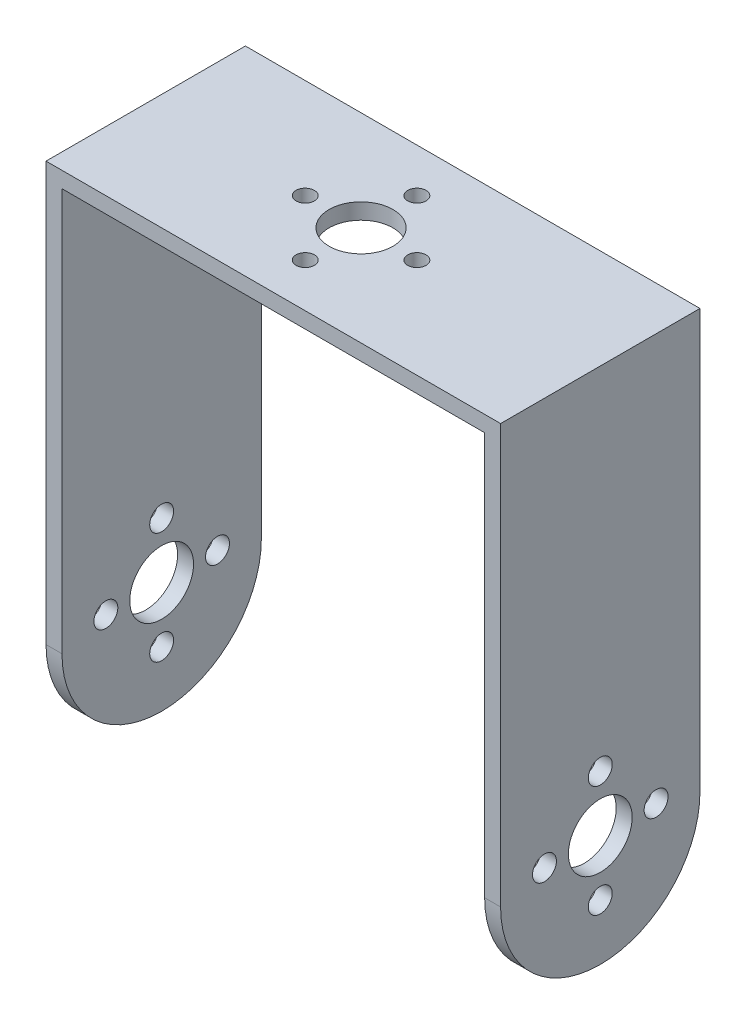
ISO-10303-21;
HEADER;
FILE_DESCRIPTION(('STEP AP214'),'2;1');
FILE_NAME('part.step','',(''),(''),'','','');
FILE_SCHEMA(('AUTOMOTIVE_DESIGN { 1 0 10303 214 1 1 1 1 }'));
ENDSEC;
DATA;
#1=APPLICATION_CONTEXT('core data for automotive mechanical design processes');
#2=APPLICATION_PROTOCOL_DEFINITION('international standard','automotive_design',2000,#1);
#3=PRODUCT_CONTEXT('',#1,'mechanical');
#4=PRODUCT('Part','Part','',(#3));
#5=PRODUCT_RELATED_PRODUCT_CATEGORY('part','',(#4));
#6=PRODUCT_DEFINITION_FORMATION('','',#4);
#7=PRODUCT_DEFINITION_CONTEXT('part definition',#1,'design');
#8=PRODUCT_DEFINITION('design','',#6,#7);
#9=PRODUCT_DEFINITION_SHAPE('','',#8);
#10=(LENGTH_UNIT() NAMED_UNIT(*) SI_UNIT(.MILLI.,.METRE.));
#11=(NAMED_UNIT(*) PLANE_ANGLE_UNIT() SI_UNIT($,.RADIAN.));
#12=(NAMED_UNIT(*) SI_UNIT($,.STERADIAN.) SOLID_ANGLE_UNIT());
#13=UNCERTAINTY_MEASURE_WITH_UNIT(LENGTH_MEASURE(1.E-05),#10,'distance_accuracy_value','');
#14=(GEOMETRIC_REPRESENTATION_CONTEXT(3) GLOBAL_UNCERTAINTY_ASSIGNED_CONTEXT((#13)) GLOBAL_UNIT_ASSIGNED_CONTEXT((#10,
#11,#12)) REPRESENTATION_CONTEXT('',''));
#15=CARTESIAN_POINT('',(0.,0.,0.));
#16=DIRECTION('',(0.,0.,1.));
#17=DIRECTION('',(1.,0.,0.));
#18=AXIS2_PLACEMENT_3D('',#15,#16,#17);
#19=CARTESIAN_POINT('',(-79.925523148209,43.3899538371544,25.));
#20=DIRECTION('',(-1.,0.,0.));
#21=DIRECTION('',(0.,0.,1.));
#22=AXIS2_PLACEMENT_3D('',#19,#20,#21);
#23=PLANE('',#22);
#24=CARTESIAN_POINT('',(-79.925523148209,-5.61349741649561,19.4999999999999));
#25=DIRECTION('',(-1.,0.,0.));
#26=DIRECTION('',(0.,0.,1.));
#27=AXIS2_PLACEMENT_3D('',#24,#25,#26);
#28=CIRCLE('',#27,1.5);
#29=CARTESIAN_POINT('',(-79.925523148209,-5.61349741649561,20.9999999999999));
#30=VERTEX_POINT('',#29);
#31=EDGE_CURVE('E218',#30,#30,#28,.T.);
#32=ORIENTED_EDGE('',*,*,#31,.T.);
#33=EDGE_LOOP('',(#32));
#34=FACE_BOUND('',#33,.T.);
#35=CARTESIAN_POINT('',(-79.925523148209,-12.6134974164956,12.4999999999999));
#36=DIRECTION('',(-1.,0.,0.));
#37=DIRECTION('',(0.,0.,1.));
#38=AXIS2_PLACEMENT_3D('',#35,#36,#37);
#39=CIRCLE('',#38,1.5);
#40=CARTESIAN_POINT('',(-79.925523148209,-12.6134974164956,13.9999999999999));
#41=VERTEX_POINT('',#40);
#42=EDGE_CURVE('E222',#41,#41,#39,.T.);
#43=ORIENTED_EDGE('',*,*,#42,.T.);
#44=EDGE_LOOP('',(#43));
#45=FACE_BOUND('',#44,.T.);
#46=CARTESIAN_POINT('',(-79.925523148209,-5.61349741649551,5.4999999999999));
#47=DIRECTION('',(-1.,0.,0.));
#48=DIRECTION('',(0.,0.,1.));
#49=AXIS2_PLACEMENT_3D('',#46,#47,#48);
#50=CIRCLE('',#49,1.5);
#51=CARTESIAN_POINT('',(-79.925523148209,-5.61349741649551,6.9999999999999));
#52=VERTEX_POINT('',#51);
#53=EDGE_CURVE('E226',#52,#52,#50,.T.);
#54=ORIENTED_EDGE('',*,*,#53,.T.);
#55=EDGE_LOOP('',(#54));
#56=FACE_BOUND('',#55,.T.);
#57=CARTESIAN_POINT('',(-79.925523148209,1.38650258350442,12.5));
#58=DIRECTION('',(-1.,0.,0.));
#59=DIRECTION('',(0.,0.,1.));
#60=AXIS2_PLACEMENT_3D('',#57,#58,#59);
#61=CIRCLE('',#60,1.5);
#62=CARTESIAN_POINT('',(-79.925523148209,1.38650258350442,14.));
#63=VERTEX_POINT('',#62);
#64=EDGE_CURVE('E230',#63,#63,#61,.T.);
#65=ORIENTED_EDGE('',*,*,#64,.T.);
#66=EDGE_LOOP('',(#65));
#67=FACE_BOUND('',#66,.T.);
#68=CARTESIAN_POINT('',(-79.925523148209,-5.61349741649557,12.5));
#69=DIRECTION('',(-1.,0.,0.));
#70=DIRECTION('',(0.,0.,1.));
#71=AXIS2_PLACEMENT_3D('',#68,#69,#70);
#72=CIRCLE('',#71,4.);
#73=CARTESIAN_POINT('',(-79.925523148209,-5.61349741649557,16.5));
#74=VERTEX_POINT('',#73);
#75=EDGE_CURVE('E168',#74,#74,#72,.T.);
#76=ORIENTED_EDGE('',*,*,#75,.T.);
#77=EDGE_LOOP('',(#76));
#78=FACE_BOUND('',#77,.T.);
#79=DIRECTION('',(0.,1.,0.));
#80=VECTOR('',#79,1.);
#81=CARTESIAN_POINT('',(-79.925523148209,43.3899538371544,25.));
#82=LINE('',#81,#80);
#83=CARTESIAN_POINT('',(-79.925523148209,-7.11349741649558,25.));
#84=VERTEX_POINT('',#83);
#85=CARTESIAN_POINT('',(-79.925523148209,43.3899538371544,25.));
#86=VERTEX_POINT('',#85);
#87=EDGE_CURVE('E137',#84,#86,#82,.T.);
#88=ORIENTED_EDGE('',*,*,#87,.F.);
#89=CARTESIAN_POINT('',(-79.925523148209,-7.11349741649558,12.5));
#90=DIRECTION('',(-1.,0.,0.));
#91=DIRECTION('',(0.,0.,1.));
#92=AXIS2_PLACEMENT_3D('',#89,#90,#91);
#93=CIRCLE('',#92,12.5);
#94=CARTESIAN_POINT('',(-79.925523148209,-7.11349741649558,0.));
#95=VERTEX_POINT('',#94);
#96=EDGE_CURVE('E109',#95,#84,#93,.T.);
#97=ORIENTED_EDGE('',*,*,#96,.F.);
#98=DIRECTION('',(0.,1.,0.));
#99=VECTOR('',#98,1.);
#100=CARTESIAN_POINT('',(-79.925523148209,43.3899538371544,0.));
#101=LINE('',#100,#99);
#102=CARTESIAN_POINT('',(-79.925523148209,43.3899538371544,0.));
#103=VERTEX_POINT('',#102);
#104=EDGE_CURVE('E125',#95,#103,#101,.T.);
#105=ORIENTED_EDGE('',*,*,#104,.T.);
#106=DIRECTION('',(0.,0.,-1.));
#107=VECTOR('',#106,1.);
#108=CARTESIAN_POINT('',(-79.925523148209,43.3899538371544,25.));
#109=LINE('',#108,#107);
#110=EDGE_CURVE('E144',#86,#103,#109,.T.);
#111=ORIENTED_EDGE('',*,*,#110,.F.);
#112=EDGE_LOOP('',(#88,#97,#105,#111));
#113=FACE_BOUND('',#112,.T.);
#114=ADVANCED_FACE('F34',(#34,#45,#56,#67,#78,#113),#23,.F.);
#115=CARTESIAN_POINT('',(-26.925523148209,43.3899538371544,25.));
#116=DIRECTION('',(1.,0.,0.));
#117=DIRECTION('',(0.,1.,0.));
#118=AXIS2_PLACEMENT_3D('',#115,#116,#117);
#119=PLANE('',#118);
#120=CARTESIAN_POINT('',(-26.925523148209,-5.61349741649559,19.4999999999999));
#121=DIRECTION('',(1.,0.,0.));
#122=DIRECTION('',(0.,1.,0.));
#123=AXIS2_PLACEMENT_3D('',#120,#121,#122);
#124=CIRCLE('',#123,1.5);
#125=CARTESIAN_POINT('',(-26.925523148209,-4.11349741649559,19.4999999999999));
#126=VERTEX_POINT('',#125);
#127=EDGE_CURVE('E425',#126,#126,#124,.T.);
#128=ORIENTED_EDGE('',*,*,#127,.T.);
#129=EDGE_LOOP('',(#128));
#130=FACE_BOUND('',#129,.T.);
#131=CARTESIAN_POINT('',(-26.925523148209,-12.6134974164956,12.4999999999999));
#132=DIRECTION('',(1.,0.,0.));
#133=DIRECTION('',(0.,1.,0.));
#134=AXIS2_PLACEMENT_3D('',#131,#132,#133);
#135=CIRCLE('',#134,1.5);
#136=CARTESIAN_POINT('',(-26.925523148209,-11.1134974164956,12.4999999999999));
#137=VERTEX_POINT('',#136);
#138=EDGE_CURVE('E417',#137,#137,#135,.T.);
#139=ORIENTED_EDGE('',*,*,#138,.T.);
#140=EDGE_LOOP('',(#139));
#141=FACE_BOUND('',#140,.T.);
#142=CARTESIAN_POINT('',(-26.925523148209,-5.61349741649549,5.4999999999999));
#143=DIRECTION('',(1.,0.,0.));
#144=DIRECTION('',(0.,1.,0.));
#145=AXIS2_PLACEMENT_3D('',#142,#143,#144);
#146=CIRCLE('',#145,1.5);
#147=CARTESIAN_POINT('',(-26.925523148209,-4.11349741649549,5.4999999999999));
#148=VERTEX_POINT('',#147);
#149=EDGE_CURVE('E283',#148,#148,#146,.T.);
#150=ORIENTED_EDGE('',*,*,#149,.T.);
#151=EDGE_LOOP('',(#150));
#152=FACE_BOUND('',#151,.T.);
#153=CARTESIAN_POINT('',(-26.925523148209,1.38650258350444,12.5));
#154=DIRECTION('',(1.,0.,0.));
#155=DIRECTION('',(0.,1.,0.));
#156=AXIS2_PLACEMENT_3D('',#153,#154,#155);
#157=CIRCLE('',#156,1.5);
#158=CARTESIAN_POINT('',(-26.925523148209,2.88650258350444,12.5));
#159=VERTEX_POINT('',#158);
#160=EDGE_CURVE('E281',#159,#159,#157,.T.);
#161=ORIENTED_EDGE('',*,*,#160,.T.);
#162=EDGE_LOOP('',(#161));
#163=FACE_BOUND('',#162,.T.);
#164=CARTESIAN_POINT('',(-26.925523148209,-5.61349741649556,12.5));
#165=DIRECTION('',(1.,0.,0.));
#166=DIRECTION('',(0.,1.,0.));
#167=AXIS2_PLACEMENT_3D('',#164,#165,#166);
#168=CIRCLE('',#167,4.);
#169=CARTESIAN_POINT('',(-26.925523148209,-1.61349741649556,12.5));
#170=VERTEX_POINT('',#169);
#171=EDGE_CURVE('E164',#170,#170,#168,.T.);
#172=ORIENTED_EDGE('',*,*,#171,.T.);
#173=EDGE_LOOP('',(#172));
#174=FACE_BOUND('',#173,.T.);
#175=CARTESIAN_POINT('',(-26.925523148209,-7.11349741649557,12.5));
#176=DIRECTION('',(1.,0.,0.));
#177=DIRECTION('',(0.,1.,0.));
#178=AXIS2_PLACEMENT_3D('',#175,#176,#177);
#179=CIRCLE('',#178,12.5);
#180=CARTESIAN_POINT('',(-26.925523148209,-7.11349741649557,25.));
#181=VERTEX_POINT('',#180);
#182=CARTESIAN_POINT('',(-26.925523148209,-7.11349741649558,0.));
#183=VERTEX_POINT('',#182);
#184=EDGE_CURVE('E48',#181,#183,#179,.T.);
#185=ORIENTED_EDGE('',*,*,#184,.F.);
#186=DIRECTION('',(0.,-1.,0.));
#187=VECTOR('',#186,1.);
#188=CARTESIAN_POINT('',(-26.925523148209,43.3899538371544,25.));
#189=LINE('',#188,#187);
#190=CARTESIAN_POINT('',(-26.925523148209,43.3899538371544,25.));
#191=VERTEX_POINT('',#190);
#192=EDGE_CURVE('E179',#191,#181,#189,.T.);
#193=ORIENTED_EDGE('',*,*,#192,.F.);
#194=DIRECTION('',(0.,0.,-1.));
#195=VECTOR('',#194,1.);
#196=CARTESIAN_POINT('',(-26.925523148209,43.3899538371544,25.));
#197=LINE('',#196,#195);
#198=CARTESIAN_POINT('',(-26.925523148209,43.3899538371544,0.));
#199=VERTEX_POINT('',#198);
#200=EDGE_CURVE('E141',#191,#199,#197,.T.);
#201=ORIENTED_EDGE('',*,*,#200,.T.);
#202=DIRECTION('',(0.,-1.,0.));
#203=VECTOR('',#202,1.);
#204=CARTESIAN_POINT('',(-26.925523148209,43.3899538371544,0.));
#205=LINE('',#204,#203);
#206=EDGE_CURVE('E130',#199,#183,#205,.T.);
#207=ORIENTED_EDGE('',*,*,#206,.T.);
#208=EDGE_LOOP('',(#185,#193,#201,#207));
#209=FACE_BOUND('',#208,.T.);
#210=ADVANCED_FACE('F190',(#130,#141,#152,#163,#174,#209),#119,.F.);
#211=CARTESIAN_POINT('',(-24.925523148209,45.3865025835044,25.));
#212=DIRECTION('',(-1.,0.,0.));
#213=DIRECTION('',(0.,-1.,0.));
#214=AXIS2_PLACEMENT_3D('',#211,#212,#213);
#215=PLANE('',#214);
#216=CARTESIAN_POINT('',(-24.925523148209,-5.61349741649559,19.4999999999999));
#217=DIRECTION('',(1.,0.,0.));
#218=DIRECTION('',(0.,1.,0.));
#219=AXIS2_PLACEMENT_3D('',#216,#217,#218);
#220=CIRCLE('',#219,1.5);
#221=CARTESIAN_POINT('',(-24.925523148209,-4.11349741649559,19.4999999999999));
#222=VERTEX_POINT('',#221);
#223=EDGE_CURVE('E260',#222,#222,#220,.T.);
#224=ORIENTED_EDGE('',*,*,#223,.F.);
#225=EDGE_LOOP('',(#224));
#226=FACE_BOUND('',#225,.T.);
#227=CARTESIAN_POINT('',(-24.925523148209,-12.6134974164956,12.4999999999999));
#228=DIRECTION('',(1.,0.,0.));
#229=DIRECTION('',(0.,1.,0.));
#230=AXIS2_PLACEMENT_3D('',#227,#228,#229);
#231=CIRCLE('',#230,1.5);
#232=CARTESIAN_POINT('',(-24.925523148209,-11.1134974164956,12.4999999999999));
#233=VERTEX_POINT('',#232);
#234=EDGE_CURVE('E264',#233,#233,#231,.T.);
#235=ORIENTED_EDGE('',*,*,#234,.F.);
#236=EDGE_LOOP('',(#235));
#237=FACE_BOUND('',#236,.T.);
#238=CARTESIAN_POINT('',(-24.925523148209,-5.61349741649549,5.4999999999999));
#239=DIRECTION('',(1.,0.,0.));
#240=DIRECTION('',(0.,1.,0.));
#241=AXIS2_PLACEMENT_3D('',#238,#239,#240);
#242=CIRCLE('',#241,1.5);
#243=CARTESIAN_POINT('',(-24.925523148209,-4.11349741649549,5.4999999999999));
#244=VERTEX_POINT('',#243);
#245=EDGE_CURVE('E268',#244,#244,#242,.T.);
#246=ORIENTED_EDGE('',*,*,#245,.F.);
#247=EDGE_LOOP('',(#246));
#248=FACE_BOUND('',#247,.T.);
#249=CARTESIAN_POINT('',(-24.925523148209,1.38650258350444,12.5));
#250=DIRECTION('',(1.,0.,0.));
#251=DIRECTION('',(0.,1.,0.));
#252=AXIS2_PLACEMENT_3D('',#249,#250,#251);
#253=CIRCLE('',#252,1.5);
#254=CARTESIAN_POINT('',(-24.925523148209,2.88650258350444,12.5));
#255=VERTEX_POINT('',#254);
#256=EDGE_CURVE('E272',#255,#255,#253,.T.);
#257=ORIENTED_EDGE('',*,*,#256,.F.);
#258=EDGE_LOOP('',(#257));
#259=FACE_BOUND('',#258,.T.);
#260=CARTESIAN_POINT('',(-24.9255231482089,-5.61349741649556,12.5));
#261=DIRECTION('',(-1.,0.,0.));
#262=DIRECTION('',(0.,-1.,0.));
#263=AXIS2_PLACEMENT_3D('',#260,#261,#262);
#264=CIRCLE('',#263,4.);
#265=CARTESIAN_POINT('',(-24.9255231482089,-9.61349741649556,12.5));
#266=VERTEX_POINT('',#265);
#267=EDGE_CURVE('E157',#266,#266,#264,.T.);
#268=ORIENTED_EDGE('',*,*,#267,.T.);
#269=EDGE_LOOP('',(#268));
#270=FACE_BOUND('',#269,.T.);
#271=DIRECTION('',(0.,1.,0.));
#272=VECTOR('',#271,1.);
#273=CARTESIAN_POINT('',(-24.925523148209,45.3865025835044,25.));
#274=LINE('',#273,#272);
#275=CARTESIAN_POINT('',(-24.9255231482089,-7.11349741649557,25.));
#276=VERTEX_POINT('',#275);
#277=CARTESIAN_POINT('',(-24.925523148209,45.3865025835044,25.));
#278=VERTEX_POINT('',#277);
#279=EDGE_CURVE('E121',#276,#278,#274,.T.);
#280=ORIENTED_EDGE('',*,*,#279,.F.);
#281=CARTESIAN_POINT('',(-24.9255231482089,-7.11349741649557,12.5));
#282=DIRECTION('',(-1.,0.,0.));
#283=DIRECTION('',(0.,-1.,0.));
#284=AXIS2_PLACEMENT_3D('',#281,#282,#283);
#285=CIRCLE('',#284,12.5);
#286=CARTESIAN_POINT('',(-24.9255231482089,-7.11349741649557,0.));
#287=VERTEX_POINT('',#286);
#288=EDGE_CURVE('E103',#287,#276,#285,.T.);
#289=ORIENTED_EDGE('',*,*,#288,.F.);
#290=DIRECTION('',(0.,1.,0.));
#291=VECTOR('',#290,1.);
#292=CARTESIAN_POINT('',(-24.925523148209,45.3865025835044,0.));
#293=LINE('',#292,#291);
#294=CARTESIAN_POINT('',(-24.925523148209,45.3865025835044,0.));
#295=VERTEX_POINT('',#294);
#296=EDGE_CURVE('E133',#287,#295,#293,.T.);
#297=ORIENTED_EDGE('',*,*,#296,.T.);
#298=DIRECTION('',(0.,0.,-1.));
#299=VECTOR('',#298,1.);
#300=CARTESIAN_POINT('',(-24.925523148209,45.3865025835044,25.));
#301=LINE('',#300,#299);
#302=EDGE_CURVE('E119',#278,#295,#301,.T.);
#303=ORIENTED_EDGE('',*,*,#302,.F.);
#304=EDGE_LOOP('',(#280,#289,#297,#303));
#305=FACE_BOUND('',#304,.T.);
#306=ADVANCED_FACE('F185',(#226,#237,#248,#259,#270,#305),#215,.F.);
#307=CARTESIAN_POINT('',(-81.925523148209,45.3865025835044,25.));
#308=DIRECTION('',(1.,0.,0.));
#309=DIRECTION('',(0.,1.,0.));
#310=AXIS2_PLACEMENT_3D('',#307,#308,#309);
#311=PLANE('',#310);
#312=CARTESIAN_POINT('',(-81.925523148209,-5.61349741649561,19.4999999999999));
#313=DIRECTION('',(1.,0.,0.));
#314=DIRECTION('',(0.,1.,0.));
#315=AXIS2_PLACEMENT_3D('',#312,#313,#314);
#316=CIRCLE('',#315,1.5);
#317=CARTESIAN_POINT('',(-81.925523148209,-4.1134974164956,19.4999999999999));
#318=VERTEX_POINT('',#317);
#319=EDGE_CURVE('E428',#318,#318,#316,.T.);
#320=ORIENTED_EDGE('',*,*,#319,.T.);
#321=EDGE_LOOP('',(#320));
#322=FACE_BOUND('',#321,.T.);
#323=CARTESIAN_POINT('',(-81.925523148209,-12.6134974164956,12.4999999999999));
#324=DIRECTION('',(1.,0.,0.));
#325=DIRECTION('',(0.,1.,0.));
#326=AXIS2_PLACEMENT_3D('',#323,#324,#325);
#327=CIRCLE('',#326,1.5);
#328=CARTESIAN_POINT('',(-81.925523148209,-11.1134974164956,12.4999999999999));
#329=VERTEX_POINT('',#328);
#330=EDGE_CURVE('E420',#329,#329,#327,.T.);
#331=ORIENTED_EDGE('',*,*,#330,.T.);
#332=EDGE_LOOP('',(#331));
#333=FACE_BOUND('',#332,.T.);
#334=CARTESIAN_POINT('',(-81.925523148209,-5.61349741649551,5.4999999999999));
#335=DIRECTION('',(1.,0.,0.));
#336=DIRECTION('',(0.,1.,0.));
#337=AXIS2_PLACEMENT_3D('',#334,#335,#336);
#338=CIRCLE('',#337,1.5);
#339=CARTESIAN_POINT('',(-81.925523148209,-4.11349741649551,5.4999999999999));
#340=VERTEX_POINT('',#339);
#341=EDGE_CURVE('E409',#340,#340,#338,.T.);
#342=ORIENTED_EDGE('',*,*,#341,.T.);
#343=EDGE_LOOP('',(#342));
#344=FACE_BOUND('',#343,.T.);
#345=CARTESIAN_POINT('',(-81.925523148209,1.38650258350442,12.5));
#346=DIRECTION('',(1.,0.,0.));
#347=DIRECTION('',(0.,1.,0.));
#348=AXIS2_PLACEMENT_3D('',#345,#346,#347);
#349=CIRCLE('',#348,1.5);
#350=CARTESIAN_POINT('',(-81.925523148209,2.88650258350442,12.5));
#351=VERTEX_POINT('',#350);
#352=EDGE_CURVE('E278',#351,#351,#349,.T.);
#353=ORIENTED_EDGE('',*,*,#352,.T.);
#354=EDGE_LOOP('',(#353));
#355=FACE_BOUND('',#354,.T.);
#356=CARTESIAN_POINT('',(-81.925523148209,-5.61349741649557,12.5));
#357=DIRECTION('',(-1.,0.,0.));
#358=DIRECTION('',(0.,-1.,0.));
#359=AXIS2_PLACEMENT_3D('',#356,#357,#358);
#360=CIRCLE('',#359,4.);
#361=CARTESIAN_POINT('',(-81.925523148209,-9.61349741649557,12.5));
#362=VERTEX_POINT('',#361);
#363=EDGE_CURVE('E154',#362,#362,#360,.T.);
#364=ORIENTED_EDGE('',*,*,#363,.F.);
#365=EDGE_LOOP('',(#364));
#366=FACE_BOUND('',#365,.T.);
#367=CARTESIAN_POINT('',(-81.925523148209,-7.11349741649558,12.5));
#368=DIRECTION('',(-1.,0.,0.));
#369=DIRECTION('',(0.,-1.,0.));
#370=AXIS2_PLACEMENT_3D('',#367,#368,#369);
#371=CIRCLE('',#370,12.5);
#372=CARTESIAN_POINT('',(-81.925523148209,-7.11349741649558,0.));
#373=VERTEX_POINT('',#372);
#374=CARTESIAN_POINT('',(-81.925523148209,-7.11349741649558,25.));
#375=VERTEX_POINT('',#374);
#376=EDGE_CURVE('E55',#373,#375,#371,.T.);
#377=ORIENTED_EDGE('',*,*,#376,.T.);
#378=DIRECTION('',(0.,-1.,0.));
#379=VECTOR('',#378,1.);
#380=CARTESIAN_POINT('',(-81.925523148209,45.3865025835044,25.));
#381=LINE('',#380,#379);
#382=CARTESIAN_POINT('',(-81.925523148209,45.3865025835044,25.));
#383=VERTEX_POINT('',#382);
#384=EDGE_CURVE('E100',#383,#375,#381,.T.);
#385=ORIENTED_EDGE('',*,*,#384,.F.);
#386=DIRECTION('',(0.,0.,-1.));
#387=VECTOR('',#386,1.);
#388=CARTESIAN_POINT('',(-81.925523148209,45.3865025835044,25.));
#389=LINE('',#388,#387);
#390=CARTESIAN_POINT('',(-81.925523148209,45.3865025835044,0.));
#391=VERTEX_POINT('',#390);
#392=EDGE_CURVE('E117',#383,#391,#389,.T.);
#393=ORIENTED_EDGE('',*,*,#392,.T.);
#394=DIRECTION('',(0.,-1.,0.));
#395=VECTOR('',#394,1.);
#396=CARTESIAN_POINT('',(-81.925523148209,45.3865025835044,0.));
#397=LINE('',#396,#395);
#398=EDGE_CURVE('E102',#391,#373,#397,.T.);
#399=ORIENTED_EDGE('',*,*,#398,.T.);
#400=EDGE_LOOP('',(#377,#385,#393,#399));
#401=FACE_BOUND('',#400,.T.);
#402=ADVANCED_FACE('F97',(#322,#333,#344,#355,#366,#401),#311,.F.);
#403=CARTESIAN_POINT('',(-79.925523148209,43.3899538371544,25.));
#404=DIRECTION('',(0.,1.,0.));
#405=DIRECTION('',(0.,0.,1.));
#406=AXIS2_PLACEMENT_3D('',#403,#404,#405);
#407=PLANE('',#406);
#408=CARTESIAN_POINT('',(-47.9255242227314,43.3899538371544,12.4999988656517));
#409=DIRECTION('',(0.,1.,0.));
#410=DIRECTION('',(0.,0.,1.));
#411=AXIS2_PLACEMENT_3D('',#408,#409,#410);
#412=CIRCLE('',#411,1.15003511903265);
#413=CARTESIAN_POINT('',(-47.9255242227314,43.3899538371544,13.6500339846844));
#414=VERTEX_POINT('',#413);
#415=EDGE_CURVE('E450',#414,#414,#412,.T.);
#416=ORIENTED_EDGE('',*,*,#415,.T.);
#417=EDGE_LOOP('',(#416));
#418=FACE_BOUND('',#417,.T.);
#419=CARTESIAN_POINT('',(-54.9255242227313,43.3899538371544,5.49999886565165));
#420=DIRECTION('',(0.,1.,0.));
#421=DIRECTION('',(0.,0.,1.));
#422=AXIS2_PLACEMENT_3D('',#419,#420,#421);
#423=CIRCLE('',#422,1.15003511903266);
#424=CARTESIAN_POINT('',(-54.9255242227313,43.3899538371544,6.65003398468431));
#425=VERTEX_POINT('',#424);
#426=EDGE_CURVE('E444',#425,#425,#423,.T.);
#427=ORIENTED_EDGE('',*,*,#426,.T.);
#428=EDGE_LOOP('',(#427));
#429=FACE_BOUND('',#428,.T.);
#430=CARTESIAN_POINT('',(-61.9255242227314,43.3899538371544,12.4999988656516));
#431=DIRECTION('',(0.,1.,0.));
#432=DIRECTION('',(0.,0.,1.));
#433=AXIS2_PLACEMENT_3D('',#430,#431,#432);
#434=CIRCLE('',#433,1.15003511903265);
#435=CARTESIAN_POINT('',(-61.9255242227314,43.3899538371544,13.6500339846843));
#436=VERTEX_POINT('',#435);
#437=EDGE_CURVE('E438',#436,#436,#434,.T.);
#438=ORIENTED_EDGE('',*,*,#437,.T.);
#439=EDGE_LOOP('',(#438));
#440=FACE_BOUND('',#439,.T.);
#441=CARTESIAN_POINT('',(-54.9255242227314,43.3899538371544,19.4999988656516));
#442=DIRECTION('',(0.,1.,0.));
#443=DIRECTION('',(0.,0.,1.));
#444=AXIS2_PLACEMENT_3D('',#441,#442,#443);
#445=CIRCLE('',#444,1.15003511903265);
#446=CARTESIAN_POINT('',(-54.9255242227314,43.3899538371544,20.6500339846843));
#447=VERTEX_POINT('',#446);
#448=EDGE_CURVE('E430',#447,#447,#445,.T.);
#449=ORIENTED_EDGE('',*,*,#448,.T.);
#450=EDGE_LOOP('',(#449));
#451=FACE_BOUND('',#450,.T.);
#452=CARTESIAN_POINT('',(-54.925523148209,43.3899538371544,12.5));
#453=DIRECTION('',(0.,1.,0.));
#454=DIRECTION('',(0.,0.,1.));
#455=AXIS2_PLACEMENT_3D('',#452,#453,#454);
#456=CIRCLE('',#455,4.00000000000001);
#457=CARTESIAN_POINT('',(-54.925523148209,43.3899538371544,16.5));
#458=VERTEX_POINT('',#457);
#459=EDGE_CURVE('E128',#458,#458,#456,.T.);
#460=ORIENTED_EDGE('',*,*,#459,.T.);
#461=EDGE_LOOP('',(#460));
#462=FACE_BOUND('',#461,.T.);
#463=DIRECTION('',(1.,0.,0.));
#464=VECTOR('',#463,1.);
#465=CARTESIAN_POINT('',(-79.925523148209,43.3899538371544,0.));
#466=LINE('',#465,#464);
#467=EDGE_CURVE('E127',#103,#199,#466,.T.);
#468=ORIENTED_EDGE('',*,*,#467,.T.);
#469=ORIENTED_EDGE('',*,*,#200,.F.);
#470=DIRECTION('',(1.,0.,0.));
#471=VECTOR('',#470,1.);
#472=CARTESIAN_POINT('',(-79.925523148209,43.3899538371544,25.));
#473=LINE('',#472,#471);
#474=EDGE_CURVE('E177',#86,#191,#473,.T.);
#475=ORIENTED_EDGE('',*,*,#474,.F.);
#476=ORIENTED_EDGE('',*,*,#110,.T.);
#477=EDGE_LOOP('',(#468,#469,#475,#476));
#478=FACE_BOUND('',#477,.T.);
#479=ADVANCED_FACE('F195',(#418,#429,#440,#451,#462,#478),#407,.F.);
#480=CARTESIAN_POINT('',(-81.925523148209,45.3865025835044,25.));
#481=DIRECTION('',(0.,-1.,0.));
#482=DIRECTION('',(0.,0.,-1.));
#483=AXIS2_PLACEMENT_3D('',#480,#481,#482);
#484=PLANE('',#483);
#485=CARTESIAN_POINT('',(-47.9255242227314,45.3865025835044,12.4999988656517));
#486=DIRECTION('',(0.,1.,0.));
#487=DIRECTION('',(0.,0.,1.));
#488=AXIS2_PLACEMENT_3D('',#485,#486,#487);
#489=CIRCLE('',#488,1.15003511903265);
#490=CARTESIAN_POINT('',(-47.9255242227314,45.3865025835044,13.6500339846844));
#491=VERTEX_POINT('',#490);
#492=EDGE_CURVE('E452',#491,#491,#489,.T.);
#493=ORIENTED_EDGE('',*,*,#492,.F.);
#494=EDGE_LOOP('',(#493));
#495=FACE_BOUND('',#494,.T.);
#496=CARTESIAN_POINT('',(-54.9255242227313,45.3865025835044,5.49999886565165));
#497=DIRECTION('',(0.,1.,0.));
#498=DIRECTION('',(0.,0.,1.));
#499=AXIS2_PLACEMENT_3D('',#496,#497,#498);
#500=CIRCLE('',#499,1.15003511903266);
#501=CARTESIAN_POINT('',(-54.9255242227313,45.3865025835044,6.65003398468431));
#502=VERTEX_POINT('',#501);
#503=EDGE_CURVE('E447',#502,#502,#500,.T.);
#504=ORIENTED_EDGE('',*,*,#503,.F.);
#505=EDGE_LOOP('',(#504));
#506=FACE_BOUND('',#505,.T.);
#507=CARTESIAN_POINT('',(-61.9255242227314,45.3865025835044,12.4999988656516));
#508=DIRECTION('',(0.,1.,0.));
#509=DIRECTION('',(0.,0.,1.));
#510=AXIS2_PLACEMENT_3D('',#507,#508,#509);
#511=CIRCLE('',#510,1.15003511903265);
#512=CARTESIAN_POINT('',(-61.9255242227314,45.3865025835044,13.6500339846843));
#513=VERTEX_POINT('',#512);
#514=EDGE_CURVE('E441',#513,#513,#511,.T.);
#515=ORIENTED_EDGE('',*,*,#514,.F.);
#516=EDGE_LOOP('',(#515));
#517=FACE_BOUND('',#516,.T.);
#518=CARTESIAN_POINT('',(-54.9255242227314,45.3865025835044,19.4999988656516));
#519=DIRECTION('',(0.,1.,0.));
#520=DIRECTION('',(0.,0.,1.));
#521=AXIS2_PLACEMENT_3D('',#518,#519,#520);
#522=CIRCLE('',#521,1.15003511903265);
#523=CARTESIAN_POINT('',(-54.9255242227314,45.3865025835044,20.6500339846843));
#524=VERTEX_POINT('',#523);
#525=EDGE_CURVE('E435',#524,#524,#522,.T.);
#526=ORIENTED_EDGE('',*,*,#525,.F.);
#527=EDGE_LOOP('',(#526));
#528=FACE_BOUND('',#527,.T.);
#529=CARTESIAN_POINT('',(-54.925523148209,45.3865025835044,12.5));
#530=DIRECTION('',(0.,1.,0.));
#531=DIRECTION('',(0.,0.,1.));
#532=AXIS2_PLACEMENT_3D('',#529,#530,#531);
#533=CIRCLE('',#532,4.00000000000001);
#534=CARTESIAN_POINT('',(-54.925523148209,45.3865025835044,16.5));
#535=VERTEX_POINT('',#534);
#536=EDGE_CURVE('E171',#535,#535,#533,.T.);
#537=ORIENTED_EDGE('',*,*,#536,.F.);
#538=EDGE_LOOP('',(#537));
#539=FACE_BOUND('',#538,.T.);
#540=DIRECTION('',(-1.,0.,0.));
#541=VECTOR('',#540,1.);
#542=CARTESIAN_POINT('',(-81.925523148209,45.3865025835044,0.));
#543=LINE('',#542,#541);
#544=EDGE_CURVE('E135',#295,#391,#543,.T.);
#545=ORIENTED_EDGE('',*,*,#544,.T.);
#546=ORIENTED_EDGE('',*,*,#392,.F.);
#547=DIRECTION('',(-1.,0.,0.));
#548=VECTOR('',#547,1.);
#549=CARTESIAN_POINT('',(-27.0429671921119,45.3865025835044,25.));
#550=LINE('',#549,#548);
#551=EDGE_CURVE('E115',#278,#383,#550,.T.);
#552=ORIENTED_EDGE('',*,*,#551,.F.);
#553=ORIENTED_EDGE('',*,*,#302,.T.);
#554=EDGE_LOOP('',(#545,#546,#552,#553));
#555=FACE_BOUND('',#554,.T.);
#556=ADVANCED_FACE('F187',(#495,#506,#517,#528,#539,#555),#484,.F.);
#557=CARTESIAN_POINT('',(0.,0.,25.));
#558=DIRECTION('',(0.,0.,1.));
#559=DIRECTION('',(1.,0.,0.));
#560=AXIS2_PLACEMENT_3D('',#557,#558,#559);
#561=PLANE('',#560);
#562=DIRECTION('',(-1.,0.,0.));
#563=VECTOR('',#562,1.);
#564=CARTESIAN_POINT('',(-24.9255231482089,-7.11349741649557,25.));
#565=LINE('',#564,#563);
#566=EDGE_CURVE('E104',#276,#181,#565,.T.);
#567=ORIENTED_EDGE('',*,*,#566,.F.);
#568=ORIENTED_EDGE('',*,*,#279,.T.);
#569=ORIENTED_EDGE('',*,*,#551,.T.);
#570=ORIENTED_EDGE('',*,*,#384,.T.);
#571=DIRECTION('',(-1.,0.,0.));
#572=VECTOR('',#571,1.);
#573=CARTESIAN_POINT('',(-24.9255231482089,-7.11349741649557,25.));
#574=LINE('',#573,#572);
#575=EDGE_CURVE('E11',#84,#375,#574,.T.);
#576=ORIENTED_EDGE('',*,*,#575,.F.);
#577=ORIENTED_EDGE('',*,*,#87,.T.);
#578=ORIENTED_EDGE('',*,*,#474,.T.);
#579=ORIENTED_EDGE('',*,*,#192,.T.);
#580=EDGE_LOOP('',(#567,#568,#569,#570,#576,#577,#578,#579));
#581=FACE_BOUND('',#580,.T.);
#582=ADVANCED_FACE('F113',(#581),#561,.T.);
#583=CARTESIAN_POINT('',(0.,0.,0.));
#584=DIRECTION('',(0.,0.,1.));
#585=DIRECTION('',(1.,0.,0.));
#586=AXIS2_PLACEMENT_3D('',#583,#584,#585);
#587=PLANE('',#586);
#588=ORIENTED_EDGE('',*,*,#296,.F.);
#589=DIRECTION('',(-1.,0.,0.));
#590=VECTOR('',#589,1.);
#591=CARTESIAN_POINT('',(-24.9255231482089,-7.11349741649557,0.));
#592=LINE('',#591,#590);
#593=EDGE_CURVE('E159',#287,#183,#592,.T.);
#594=ORIENTED_EDGE('',*,*,#593,.T.);
#595=ORIENTED_EDGE('',*,*,#206,.F.);
#596=ORIENTED_EDGE('',*,*,#467,.F.);
#597=ORIENTED_EDGE('',*,*,#104,.F.);
#598=DIRECTION('',(-1.,0.,0.));
#599=VECTOR('',#598,1.);
#600=CARTESIAN_POINT('',(-24.9255231482089,-7.11349741649557,0.));
#601=LINE('',#600,#599);
#602=EDGE_CURVE('E41',#95,#373,#601,.T.);
#603=ORIENTED_EDGE('',*,*,#602,.T.);
#604=ORIENTED_EDGE('',*,*,#398,.F.);
#605=ORIENTED_EDGE('',*,*,#544,.F.);
#606=EDGE_LOOP('',(#588,#594,#595,#596,#597,#603,#604,#605));
#607=FACE_BOUND('',#606,.T.);
#608=ADVANCED_FACE('F149',(#607),#587,.F.);
#609=CARTESIAN_POINT('',(-54.925523148209,-19.6134974164956,12.5));
#610=DIRECTION('',(0.,1.,0.));
#611=DIRECTION('',(0.,0.,1.));
#612=AXIS2_PLACEMENT_3D('',#609,#610,#611);
#613=CYLINDRICAL_SURFACE('',#612,4.00000000000001);
#614=ORIENTED_EDGE('',*,*,#536,.T.);
#615=EDGE_LOOP('',(#614));
#616=FACE_BOUND('',#615,.T.);
#617=ORIENTED_EDGE('',*,*,#459,.F.);
#618=EDGE_LOOP('',(#617));
#619=FACE_BOUND('',#618,.T.);
#620=ADVANCED_FACE('F236',(#616,#619),#613,.F.);
#621=CARTESIAN_POINT('',(-24.9255231482089,-5.61349741649556,12.5));
#622=DIRECTION('',(-1.,0.,0.));
#623=DIRECTION('',(0.,-1.,0.));
#624=AXIS2_PLACEMENT_3D('',#621,#622,#623);
#625=CYLINDRICAL_SURFACE('',#624,4.);
#626=ORIENTED_EDGE('',*,*,#363,.T.);
#627=EDGE_LOOP('',(#626));
#628=FACE_BOUND('',#627,.T.);
#629=ORIENTED_EDGE('',*,*,#75,.F.);
#630=EDGE_LOOP('',(#629));
#631=FACE_BOUND('',#630,.T.);
#632=ADVANCED_FACE('F233',(#628,#631),#625,.F.);
#633=ORIENTED_EDGE('',*,*,#267,.F.);
#634=EDGE_LOOP('',(#633));
#635=FACE_BOUND('',#634,.T.);
#636=ORIENTED_EDGE('',*,*,#171,.F.);
#637=EDGE_LOOP('',(#636));
#638=FACE_BOUND('',#637,.T.);
#639=ADVANCED_FACE('F235',(#635,#638),#625,.F.);
#640=CARTESIAN_POINT('',(-24.9255231482089,-7.11349741649557,12.5));
#641=DIRECTION('',(-1.,0.,0.));
#642=DIRECTION('',(0.,-1.,0.));
#643=AXIS2_PLACEMENT_3D('',#640,#641,#642);
#644=CYLINDRICAL_SURFACE('',#643,12.5);
#645=ORIENTED_EDGE('',*,*,#96,.T.);
#646=ORIENTED_EDGE('',*,*,#575,.T.);
#647=ORIENTED_EDGE('',*,*,#376,.F.);
#648=ORIENTED_EDGE('',*,*,#602,.F.);
#649=EDGE_LOOP('',(#645,#646,#647,#648));
#650=FACE_BOUND('',#649,.T.);
#651=ADVANCED_FACE('F107',(#650),#644,.T.);
#652=ORIENTED_EDGE('',*,*,#184,.T.);
#653=ORIENTED_EDGE('',*,*,#593,.F.);
#654=ORIENTED_EDGE('',*,*,#288,.T.);
#655=ORIENTED_EDGE('',*,*,#566,.T.);
#656=EDGE_LOOP('',(#652,#653,#654,#655));
#657=FACE_BOUND('',#656,.T.);
#658=ADVANCED_FACE('F290',(#657),#644,.T.);
#659=CARTESIAN_POINT('',(-81.925523148209,1.38650258350442,12.5));
#660=DIRECTION('',(1.,0.,0.));
#661=DIRECTION('',(0.,1.,0.));
#662=AXIS2_PLACEMENT_3D('',#659,#660,#661);
#663=CYLINDRICAL_SURFACE('',#662,1.5);
#664=ORIENTED_EDGE('',*,*,#352,.F.);
#665=EDGE_LOOP('',(#664));
#666=FACE_BOUND('',#665,.T.);
#667=ORIENTED_EDGE('',*,*,#64,.F.);
#668=EDGE_LOOP('',(#667));
#669=FACE_BOUND('',#668,.T.);
#670=ADVANCED_FACE('F292',(#666,#669),#663,.F.);
#671=ORIENTED_EDGE('',*,*,#256,.T.);
#672=EDGE_LOOP('',(#671));
#673=FACE_BOUND('',#672,.T.);
#674=ORIENTED_EDGE('',*,*,#160,.F.);
#675=EDGE_LOOP('',(#674));
#676=FACE_BOUND('',#675,.T.);
#677=ADVANCED_FACE('F297',(#673,#676),#663,.F.);
#678=CARTESIAN_POINT('',(-81.925523148209,-5.61349741649551,5.4999999999999));
#679=DIRECTION('',(1.,0.,0.));
#680=DIRECTION('',(0.,1.,0.));
#681=AXIS2_PLACEMENT_3D('',#678,#679,#680);
#682=CYLINDRICAL_SURFACE('',#681,1.5);
#683=ORIENTED_EDGE('',*,*,#341,.F.);
#684=EDGE_LOOP('',(#683));
#685=FACE_BOUND('',#684,.T.);
#686=ORIENTED_EDGE('',*,*,#53,.F.);
#687=EDGE_LOOP('',(#686));
#688=FACE_BOUND('',#687,.T.);
#689=ADVANCED_FACE('F398',(#685,#688),#682,.F.);
#690=ORIENTED_EDGE('',*,*,#245,.T.);
#691=EDGE_LOOP('',(#690));
#692=FACE_BOUND('',#691,.T.);
#693=ORIENTED_EDGE('',*,*,#149,.F.);
#694=EDGE_LOOP('',(#693));
#695=FACE_BOUND('',#694,.T.);
#696=ADVANCED_FACE('F396',(#692,#695),#682,.F.);
#697=CARTESIAN_POINT('',(-81.925523148209,-12.6134974164956,12.4999999999999));
#698=DIRECTION('',(1.,0.,0.));
#699=DIRECTION('',(0.,1.,0.));
#700=AXIS2_PLACEMENT_3D('',#697,#698,#699);
#701=CYLINDRICAL_SURFACE('',#700,1.5);
#702=ORIENTED_EDGE('',*,*,#330,.F.);
#703=EDGE_LOOP('',(#702));
#704=FACE_BOUND('',#703,.T.);
#705=ORIENTED_EDGE('',*,*,#42,.F.);
#706=EDGE_LOOP('',(#705));
#707=FACE_BOUND('',#706,.T.);
#708=ADVANCED_FACE('F393',(#704,#707),#701,.F.);
#709=ORIENTED_EDGE('',*,*,#234,.T.);
#710=EDGE_LOOP('',(#709));
#711=FACE_BOUND('',#710,.T.);
#712=ORIENTED_EDGE('',*,*,#138,.F.);
#713=EDGE_LOOP('',(#712));
#714=FACE_BOUND('',#713,.T.);
#715=ADVANCED_FACE('F391',(#711,#714),#701,.F.);
#716=CARTESIAN_POINT('',(-81.925523148209,-5.61349741649561,19.4999999999999));
#717=DIRECTION('',(1.,0.,0.));
#718=DIRECTION('',(0.,1.,0.));
#719=AXIS2_PLACEMENT_3D('',#716,#717,#718);
#720=CYLINDRICAL_SURFACE('',#719,1.5);
#721=ORIENTED_EDGE('',*,*,#319,.F.);
#722=EDGE_LOOP('',(#721));
#723=FACE_BOUND('',#722,.T.);
#724=ORIENTED_EDGE('',*,*,#31,.F.);
#725=EDGE_LOOP('',(#724));
#726=FACE_BOUND('',#725,.T.);
#727=ADVANCED_FACE('F388',(#723,#726),#720,.F.);
#728=ORIENTED_EDGE('',*,*,#223,.T.);
#729=EDGE_LOOP('',(#728));
#730=FACE_BOUND('',#729,.T.);
#731=ORIENTED_EDGE('',*,*,#127,.F.);
#732=EDGE_LOOP('',(#731));
#733=FACE_BOUND('',#732,.T.);
#734=ADVANCED_FACE('F349',(#730,#733),#720,.F.);
#735=CARTESIAN_POINT('',(-54.9255242227314,-19.6134974164956,19.4999988656516));
#736=DIRECTION('',(0.,1.,0.));
#737=DIRECTION('',(0.,0.,1.));
#738=AXIS2_PLACEMENT_3D('',#735,#736,#737);
#739=CYLINDRICAL_SURFACE('',#738,1.15003511903265);
#740=ORIENTED_EDGE('',*,*,#525,.T.);
#741=EDGE_LOOP('',(#740));
#742=FACE_BOUND('',#741,.T.);
#743=ORIENTED_EDGE('',*,*,#448,.F.);
#744=EDGE_LOOP('',(#743));
#745=FACE_BOUND('',#744,.T.);
#746=ADVANCED_FACE('F343',(#742,#745),#739,.F.);
#747=CARTESIAN_POINT('',(-61.9255242227314,-19.6134974164956,12.4999988656516));
#748=DIRECTION('',(0.,1.,0.));
#749=DIRECTION('',(0.,0.,1.));
#750=AXIS2_PLACEMENT_3D('',#747,#748,#749);
#751=CYLINDRICAL_SURFACE('',#750,1.15003511903265);
#752=ORIENTED_EDGE('',*,*,#514,.T.);
#753=EDGE_LOOP('',(#752));
#754=FACE_BOUND('',#753,.T.);
#755=ORIENTED_EDGE('',*,*,#437,.F.);
#756=EDGE_LOOP('',(#755));
#757=FACE_BOUND('',#756,.T.);
#758=ADVANCED_FACE('F348',(#754,#757),#751,.F.);
#759=CARTESIAN_POINT('',(-54.9255242227313,-19.6134974164956,5.49999886565165));
#760=DIRECTION('',(0.,1.,0.));
#761=DIRECTION('',(0.,0.,1.));
#762=AXIS2_PLACEMENT_3D('',#759,#760,#761);
#763=CYLINDRICAL_SURFACE('',#762,1.15003511903266);
#764=ORIENTED_EDGE('',*,*,#503,.T.);
#765=EDGE_LOOP('',(#764));
#766=FACE_BOUND('',#765,.T.);
#767=ORIENTED_EDGE('',*,*,#426,.F.);
#768=EDGE_LOOP('',(#767));
#769=FACE_BOUND('',#768,.T.);
#770=ADVANCED_FACE('F361',(#766,#769),#763,.F.);
#771=CARTESIAN_POINT('',(-47.9255242227314,-19.6134974164956,12.4999988656517));
#772=DIRECTION('',(0.,1.,0.));
#773=DIRECTION('',(0.,0.,1.));
#774=AXIS2_PLACEMENT_3D('',#771,#772,#773);
#775=CYLINDRICAL_SURFACE('',#774,1.15003511903265);
#776=ORIENTED_EDGE('',*,*,#492,.T.);
#777=EDGE_LOOP('',(#776));
#778=FACE_BOUND('',#777,.T.);
#779=ORIENTED_EDGE('',*,*,#415,.F.);
#780=EDGE_LOOP('',(#779));
#781=FACE_BOUND('',#780,.T.);
#782=ADVANCED_FACE('F371',(#778,#781),#775,.F.);
#783=CLOSED_SHELL('',(#114,#210,#306,#402,#479,#556,#582,#608,#620,#632,#639,#651,#658,#670,
#677,#689,#696,#708,#715,#727,#734,#746,#758,#770,#782));
#784=MANIFOLD_SOLID_BREP('B2',#783);
#785=ADVANCED_BREP_SHAPE_REPRESENTATION('',(#18,#784),#14);
#786=SHAPE_DEFINITION_REPRESENTATION(#9,#785);
ENDSEC;
END-ISO-10303-21;
